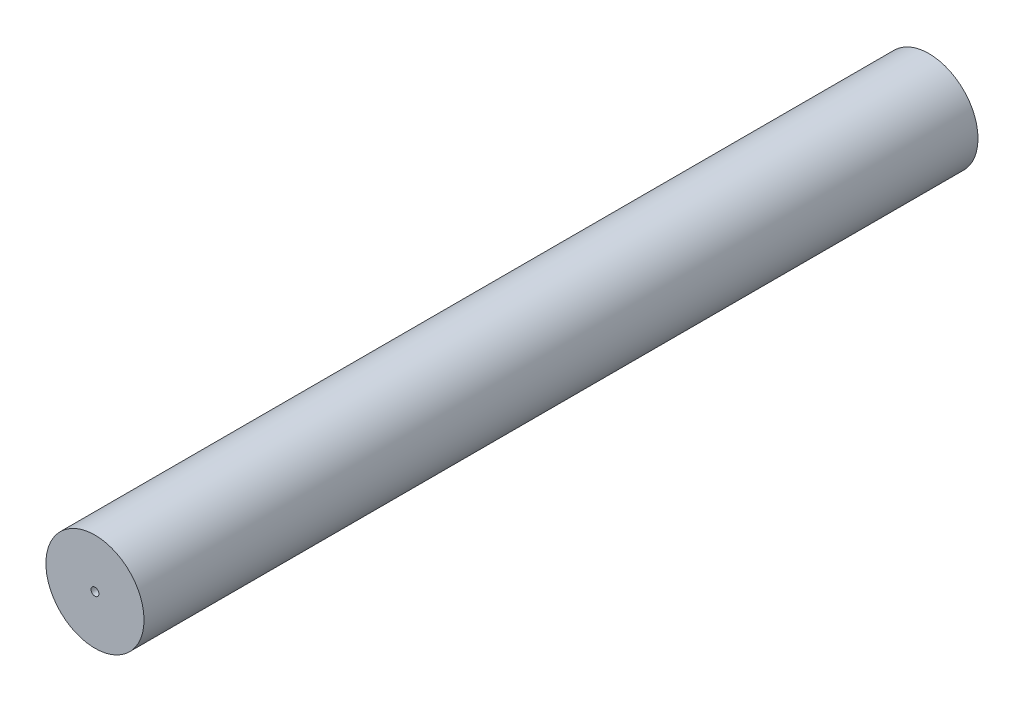
ISO-10303-21;
HEADER;
FILE_DESCRIPTION(('STEP AP214'),'2;1');
FILE_NAME('part.step','',(''),(''),'','','');
FILE_SCHEMA(('AUTOMOTIVE_DESIGN { 1 0 10303 214 1 1 1 1 }'));
ENDSEC;
DATA;
#1=APPLICATION_CONTEXT('core data for automotive mechanical design processes');
#2=APPLICATION_PROTOCOL_DEFINITION('international standard','automotive_design',2000,#1);
#3=PRODUCT_CONTEXT('',#1,'mechanical');
#4=PRODUCT('Part','Part','',(#3));
#5=PRODUCT_RELATED_PRODUCT_CATEGORY('part','',(#4));
#6=PRODUCT_DEFINITION_FORMATION('','',#4);
#7=PRODUCT_DEFINITION_CONTEXT('part definition',#1,'design');
#8=PRODUCT_DEFINITION('design','',#6,#7);
#9=PRODUCT_DEFINITION_SHAPE('','',#8);
#10=(LENGTH_UNIT() NAMED_UNIT(*) SI_UNIT(.MILLI.,.METRE.));
#11=(NAMED_UNIT(*) PLANE_ANGLE_UNIT() SI_UNIT($,.RADIAN.));
#12=(NAMED_UNIT(*) SI_UNIT($,.STERADIAN.) SOLID_ANGLE_UNIT());
#13=UNCERTAINTY_MEASURE_WITH_UNIT(LENGTH_MEASURE(1.E-05),#10,'distance_accuracy_value','');
#14=(GEOMETRIC_REPRESENTATION_CONTEXT(3) GLOBAL_UNCERTAINTY_ASSIGNED_CONTEXT((#13)) GLOBAL_UNIT_ASSIGNED_CONTEXT((#10,
#11,#12)) REPRESENTATION_CONTEXT('',''));
#15=CARTESIAN_POINT('',(0.,0.,0.));
#16=DIRECTION('',(0.,0.,1.));
#17=DIRECTION('',(1.,0.,0.));
#18=AXIS2_PLACEMENT_3D('',#15,#16,#17);
#19=CARTESIAN_POINT('',(0.,0.,85.));
#20=DIRECTION('',(0.,0.,-1.));
#21=DIRECTION('',(-1.,0.,0.));
#22=AXIS2_PLACEMENT_3D('',#19,#20,#21);
#23=CYLINDRICAL_SURFACE('',#22,5.);
#24=CARTESIAN_POINT('',(0.,0.,85.));
#25=DIRECTION('',(0.,0.,1.));
#26=DIRECTION('',(1.,0.,0.));
#27=AXIS2_PLACEMENT_3D('',#24,#25,#26);
#28=CIRCLE('',#27,5.);
#29=CARTESIAN_POINT('',(5.,0.,85.));
#30=VERTEX_POINT('',#29);
#31=EDGE_CURVE('E10',#30,#30,#28,.T.);
#32=ORIENTED_EDGE('',*,*,#31,.F.);
#33=EDGE_LOOP('',(#32));
#34=FACE_BOUND('',#33,.T.);
#35=CARTESIAN_POINT('',(0.,0.,0.));
#36=DIRECTION('',(0.,0.,1.));
#37=DIRECTION('',(1.,0.,0.));
#38=AXIS2_PLACEMENT_3D('',#35,#36,#37);
#39=CIRCLE('',#38,5.);
#40=CARTESIAN_POINT('',(5.,0.,0.));
#41=VERTEX_POINT('',#40);
#42=EDGE_CURVE('E40',#41,#41,#39,.T.);
#43=ORIENTED_EDGE('',*,*,#42,.T.);
#44=EDGE_LOOP('',(#43));
#45=FACE_BOUND('',#44,.T.);
#46=ADVANCED_FACE('F37',(#34,#45),#23,.T.);
#47=CARTESIAN_POINT('',(0.,0.,85.));
#48=DIRECTION('',(0.,0.,1.));
#49=DIRECTION('',(1.,0.,0.));
#50=AXIS2_PLACEMENT_3D('',#47,#48,#49);
#51=PLANE('',#50);
#52=CARTESIAN_POINT('',(0.,0.,85.));
#53=DIRECTION('',(0.,0.,1.));
#54=DIRECTION('',(1.,0.,0.));
#55=AXIS2_PLACEMENT_3D('',#52,#53,#54);
#56=CIRCLE('',#55,0.4);
#57=CARTESIAN_POINT('',(0.4,0.,85.));
#58=VERTEX_POINT('',#57);
#59=EDGE_CURVE('E51',#58,#58,#56,.T.);
#60=ORIENTED_EDGE('',*,*,#59,.F.);
#61=EDGE_LOOP('',(#60));
#62=FACE_BOUND('',#61,.T.);
#63=ORIENTED_EDGE('',*,*,#31,.T.);
#64=EDGE_LOOP('',(#63));
#65=FACE_BOUND('',#64,.T.);
#66=ADVANCED_FACE('F68',(#62,#65),#51,.T.);
#67=CARTESIAN_POINT('',(0.,0.,0.));
#68=DIRECTION('',(0.,0.,1.));
#69=DIRECTION('',(1.,0.,0.));
#70=AXIS2_PLACEMENT_3D('',#67,#68,#69);
#71=PLANE('',#70);
#72=CARTESIAN_POINT('',(0.,0.,0.));
#73=DIRECTION('',(0.,0.,1.));
#74=DIRECTION('',(1.,0.,0.));
#75=AXIS2_PLACEMENT_3D('',#72,#73,#74);
#76=CIRCLE('',#75,0.4);
#77=CARTESIAN_POINT('',(0.4,0.,0.));
#78=VERTEX_POINT('',#77);
#79=EDGE_CURVE('E49',#78,#78,#76,.T.);
#80=ORIENTED_EDGE('',*,*,#79,.T.);
#81=EDGE_LOOP('',(#80));
#82=FACE_BOUND('',#81,.T.);
#83=ORIENTED_EDGE('',*,*,#42,.F.);
#84=EDGE_LOOP('',(#83));
#85=FACE_BOUND('',#84,.T.);
#86=ADVANCED_FACE('F59',(#82,#85),#71,.F.);
#87=CARTESIAN_POINT('',(0.,0.,0.));
#88=DIRECTION('',(0.,0.,1.));
#89=DIRECTION('',(1.,0.,0.));
#90=AXIS2_PLACEMENT_3D('',#87,#88,#89);
#91=CYLINDRICAL_SURFACE('',#90,0.4);
#92=ORIENTED_EDGE('',*,*,#79,.F.);
#93=EDGE_LOOP('',(#92));
#94=FACE_BOUND('',#93,.T.);
#95=ORIENTED_EDGE('',*,*,#59,.T.);
#96=EDGE_LOOP('',(#95));
#97=FACE_BOUND('',#96,.T.);
#98=ADVANCED_FACE('F62',(#94,#97),#91,.F.);
#99=CLOSED_SHELL('',(#46,#66,#86,#98));
#100=MANIFOLD_SOLID_BREP('B2',#99);
#101=ADVANCED_BREP_SHAPE_REPRESENTATION('',(#18,#100),#14);
#102=SHAPE_DEFINITION_REPRESENTATION(#9,#101);
ENDSEC;
END-ISO-10303-21;
